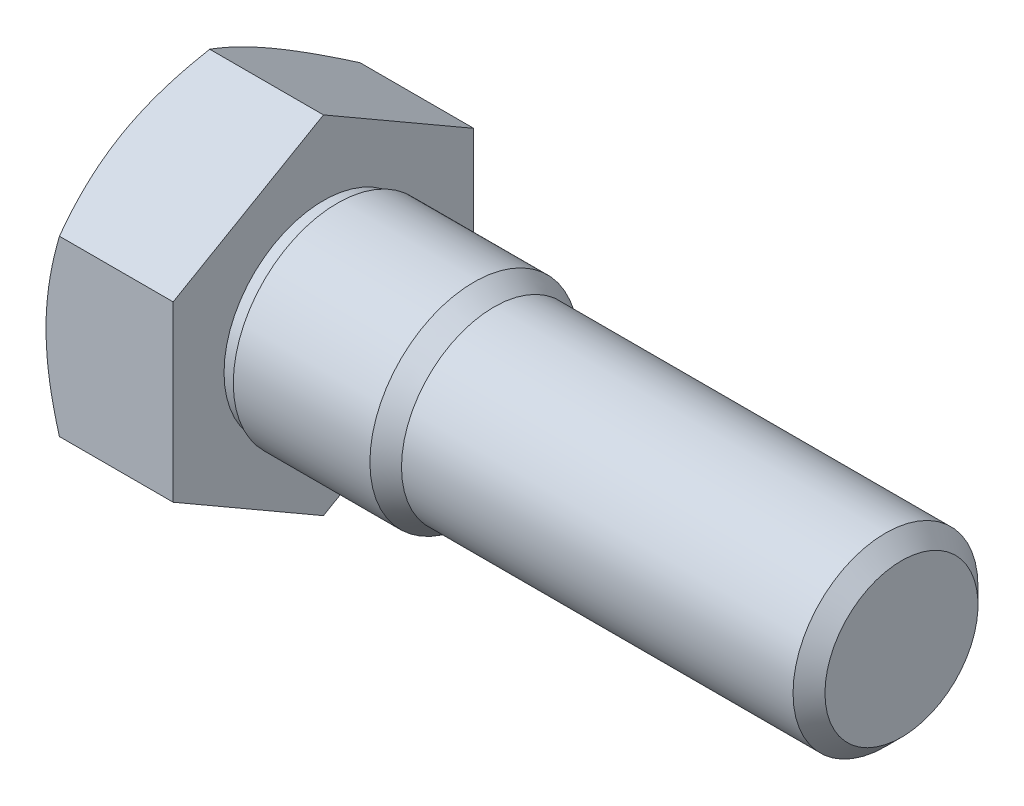
ISO-10303-21;
HEADER;
FILE_DESCRIPTION(('STEP AP214'),'2;1');
FILE_NAME('part.step','',(''),(''),'','','');
FILE_SCHEMA(('AUTOMOTIVE_DESIGN { 1 0 10303 214 1 1 1 1 }'));
ENDSEC;
DATA;
#1=APPLICATION_CONTEXT('core data for automotive mechanical design processes');
#2=APPLICATION_PROTOCOL_DEFINITION('international standard','automotive_design',2000,#1);
#3=PRODUCT_CONTEXT('',#1,'mechanical');
#4=PRODUCT('Part','Part','',(#3));
#5=PRODUCT_RELATED_PRODUCT_CATEGORY('part','',(#4));
#6=PRODUCT_DEFINITION_FORMATION('','',#4);
#7=PRODUCT_DEFINITION_CONTEXT('part definition',#1,'design');
#8=PRODUCT_DEFINITION('design','',#6,#7);
#9=PRODUCT_DEFINITION_SHAPE('','',#8);
#10=(LENGTH_UNIT() NAMED_UNIT(*) SI_UNIT(.MILLI.,.METRE.));
#11=(NAMED_UNIT(*) PLANE_ANGLE_UNIT() SI_UNIT($,.RADIAN.));
#12=(NAMED_UNIT(*) SI_UNIT($,.STERADIAN.) SOLID_ANGLE_UNIT());
#13=UNCERTAINTY_MEASURE_WITH_UNIT(LENGTH_MEASURE(1.E-05),#10,'distance_accuracy_value','');
#14=(GEOMETRIC_REPRESENTATION_CONTEXT(3) GLOBAL_UNCERTAINTY_ASSIGNED_CONTEXT((#13)) GLOBAL_UNIT_ASSIGNED_CONTEXT((#10,
#11,#12)) REPRESENTATION_CONTEXT('',''));
#15=CARTESIAN_POINT('',(0.,0.,0.));
#16=DIRECTION('',(0.,0.,1.));
#17=DIRECTION('',(1.,0.,0.));
#18=AXIS2_PLACEMENT_3D('',#15,#16,#17);
#19=CARTESIAN_POINT('',(5.5,7.50555349946514,0.));
#20=DIRECTION('',(1.,0.,0.));
#21=DIRECTION('',(0.,0.,-1.));
#22=AXIS2_PLACEMENT_3D('',#19,#20,#21);
#23=PLANE('',#22);
#24=DIRECTION('',(0.,0.5,0.866025403784439));
#25=VECTOR('',#24,1.);
#26=CARTESIAN_POINT('',(5.5,3.75277674973257,-6.5));
#27=LINE('',#26,#25);
#28=CARTESIAN_POINT('',(5.5,3.75277674973257,-6.5));
#29=VERTEX_POINT('',#28);
#30=CARTESIAN_POINT('',(5.5,7.50555349946514,0.));
#31=VERTEX_POINT('',#30);
#32=EDGE_CURVE('E157',#29,#31,#27,.T.);
#33=ORIENTED_EDGE('',*,*,#32,.T.);
#34=DIRECTION('',(0.,-0.5,0.866025403784439));
#35=VECTOR('',#34,1.);
#36=CARTESIAN_POINT('',(5.5,7.50555349946514,0.));
#37=LINE('',#36,#35);
#38=CARTESIAN_POINT('',(5.5,3.75277674973257,6.5));
#39=VERTEX_POINT('',#38);
#40=EDGE_CURVE('E155',#31,#39,#37,.T.);
#41=ORIENTED_EDGE('',*,*,#40,.T.);
#42=DIRECTION('',(0.,-1.,0.));
#43=VECTOR('',#42,1.);
#44=CARTESIAN_POINT('',(5.5,3.75277674973257,6.5));
#45=LINE('',#44,#43);
#46=CARTESIAN_POINT('',(5.5,-3.75277674973257,6.5));
#47=VERTEX_POINT('',#46);
#48=EDGE_CURVE('E132',#39,#47,#45,.T.);
#49=ORIENTED_EDGE('',*,*,#48,.T.);
#50=DIRECTION('',(0.,-0.5,-0.866025403784439));
#51=VECTOR('',#50,1.);
#52=CARTESIAN_POINT('',(5.5,-3.75277674973257,6.5));
#53=LINE('',#52,#51);
#54=CARTESIAN_POINT('',(5.5,-7.50555349946513,0.));
#55=VERTEX_POINT('',#54);
#56=EDGE_CURVE('E152',#47,#55,#53,.T.);
#57=ORIENTED_EDGE('',*,*,#56,.T.);
#58=DIRECTION('',(0.,0.5,-0.866025403784439));
#59=VECTOR('',#58,1.);
#60=CARTESIAN_POINT('',(5.5,-7.50555349946513,0.));
#61=LINE('',#60,#59);
#62=CARTESIAN_POINT('',(5.5,-3.75277674973257,-6.5));
#63=VERTEX_POINT('',#62);
#64=EDGE_CURVE('E150',#55,#63,#61,.T.);
#65=ORIENTED_EDGE('',*,*,#64,.T.);
#66=DIRECTION('',(0.,1.,0.));
#67=VECTOR('',#66,1.);
#68=CARTESIAN_POINT('',(5.5,-3.75277674973257,-6.5));
#69=LINE('',#68,#67);
#70=EDGE_CURVE('E148',#63,#29,#69,.T.);
#71=ORIENTED_EDGE('',*,*,#70,.T.);
#72=EDGE_LOOP('',(#33,#41,#49,#57,#65,#71));
#73=FACE_BOUND('',#72,.T.);
#74=CARTESIAN_POINT('',(5.5,0.,0.));
#75=DIRECTION('',(-1.,0.,0.));
#76=DIRECTION('',(0.,0.,1.));
#77=AXIS2_PLACEMENT_3D('',#74,#75,#76);
#78=CIRCLE('',#77,4.3);
#79=CARTESIAN_POINT('',(5.5,0.,4.3));
#80=VERTEX_POINT('',#79);
#81=EDGE_CURVE('E250',#80,#80,#78,.T.);
#82=ORIENTED_EDGE('',*,*,#81,.T.);
#83=EDGE_LOOP('',(#82));
#84=FACE_BOUND('',#83,.T.);
#85=ADVANCED_FACE('F39',(#73,#84),#23,.T.);
#86=CARTESIAN_POINT('',(5.5,3.75277674973257,-6.5));
#87=DIRECTION('',(0.,-0.866025403784439,0.5));
#88=DIRECTION('',(0.,-0.5,-0.866025403784439));
#89=AXIS2_PLACEMENT_3D('',#86,#87,#88);
#90=PLANE('',#89);
#91=CARTESIAN_POINT('',(0.580623251805862,7.50566896951898,0.000199999999999986));
#92=CARTESIAN_POINT('',(0.533004423075481,7.4231786300702,-0.14267745905888));
#93=CARTESIAN_POINT('',(0.487546700602702,7.34038072665458,-0.286087634534913));
#94=CARTESIAN_POINT('',(0.401548682023043,7.17411251123976,-0.574072631317195));
#95=CARTESIAN_POINT('',(0.361010507228023,7.09064192560665,-0.718647926571264));
#96=CARTESIAN_POINT('',(0.247571001123207,6.83889369625719,-1.15468865052003));
#97=CARTESIAN_POINT('',(0.183047807128739,6.66962231516081,-1.44787528284632));
#98=CARTESIAN_POINT('',(0.107386583547492,6.41631077211556,-1.88662374554437));
#99=CARTESIAN_POINT('',(0.0858328564569877,6.33302748139455,-2.03087463649469));
#100=CARTESIAN_POINT('',(0.0496903146061197,6.16608458377294,-2.32002821713809));
#101=CARTESIAN_POINT('',(0.0351008844596676,6.08242501078143,-2.46493084809889));
#102=CARTESIAN_POINT('',(0.0132587525073481,5.91496056339807,-2.75498777942832));
#103=CARTESIAN_POINT('',(0.00599772432210918,5.83115596252171,-2.90014160605421));
#104=CARTESIAN_POINT('',(-0.00103969741776723,5.66347396979287,-3.19057533697495));
#105=CARTESIAN_POINT('',(-0.000816322187793967,5.57959658026911,-3.33585523723636));
#106=CARTESIAN_POINT('',(0.0100834585151664,5.34979921898454,-3.73387594242649));
#107=CARTESIAN_POINT('',(0.0283818178694141,5.20395446807007,-3.98648646102757));
#108=CARTESIAN_POINT('',(0.0864063414576747,4.91323365606636,-4.49002967823568));
#109=CARTESIAN_POINT('',(0.126152338538244,4.76835861741226,-4.74096060593308));
#110=CARTESIAN_POINT('',(0.225505903202147,4.47705272008732,-5.24551722064432));
#111=CARTESIAN_POINT('',(0.285534425638024,4.33065861912703,-5.49907924143591));
#112=CARTESIAN_POINT('',(0.421774992509864,4.04005357906494,-6.00242193575904));
#113=CARTESIAN_POINT('',(0.497955034163588,3.89583891821182,-6.25220905555296));
#114=CARTESIAN_POINT('',(0.58062325180586,3.75266127967874,-6.5002));
#115=B_SPLINE_CURVE_WITH_KNOTS('',3,(#91,#92,#93,#94,#95,#96,#97,#98,#99,#100,#101,#102,#103,
#104,#105,#106,#107,#108,#109,#110,#111,#112,#113,#114),.UNSPECIFIED.,.F.,.F.,(4,2,2,2,2,2,2,2,
2,2,2,4),(0.,0.515105052395587,1.03043143507524,2.06322554824262,2.56697389547996,
3.07067772176453,3.57380860368927,4.07692394242519,4.9527935470566,5.82947446853466,
6.72559912449736,7.61996451221045),.UNSPECIFIED.);
#116=CARTESIAN_POINT('',(0.580556583600758,7.50555349946514,0.));
#117=VERTEX_POINT('',#116);
#118=CARTESIAN_POINT('',(0.,5.62916512459885,-3.25));
#119=VERTEX_POINT('',#118);
#120=EDGE_CURVE('E56',#117,#119,#115,.T.);
#121=ORIENTED_EDGE('',*,*,#120,.F.);
#122=DIRECTION('',(-1.,0.,0.));
#123=VECTOR('',#122,1.);
#124=CARTESIAN_POINT('',(5.5,7.50555349946514,0.));
#125=LINE('',#124,#123);
#126=EDGE_CURVE('E133',#31,#117,#125,.T.);
#127=ORIENTED_EDGE('',*,*,#126,.F.);
#128=ORIENTED_EDGE('',*,*,#32,.F.);
#129=DIRECTION('',(-1.,0.,0.));
#130=VECTOR('',#129,1.);
#131=CARTESIAN_POINT('',(5.5,3.75277674973257,-6.5));
#132=LINE('',#131,#130);
#133=CARTESIAN_POINT('',(0.580556583600758,3.75277674973258,-6.5));
#134=VERTEX_POINT('',#133);
#135=EDGE_CURVE('E145',#29,#134,#132,.T.);
#136=ORIENTED_EDGE('',*,*,#135,.T.);
#137=EDGE_CURVE('E204',#119,#134,#115,.T.);
#138=ORIENTED_EDGE('',*,*,#137,.F.);
#139=EDGE_LOOP('',(#121,#127,#128,#136,#138));
#140=FACE_BOUND('',#139,.T.);
#141=ADVANCED_FACE('F41',(#140),#90,.F.);
#142=CARTESIAN_POINT('',(5.5,7.50555349946514,0.));
#143=DIRECTION('',(0.,-0.866025403784439,-0.5));
#144=DIRECTION('',(0.,0.5,-0.866025403784439));
#145=AXIS2_PLACEMENT_3D('',#142,#143,#144);
#146=PLANE('',#145);
#147=CARTESIAN_POINT('',(0.580623251805863,3.75266127967873,6.5002));
#148=CARTESIAN_POINT('',(0.533004423075481,3.83515161912751,6.35732254094112));
#149=CARTESIAN_POINT('',(0.487546700602703,3.91794952254313,6.21391236546509));
#150=CARTESIAN_POINT('',(0.401548682023043,4.08421773795795,5.92592736868281));
#151=CARTESIAN_POINT('',(0.361010507228023,4.16768832359106,5.78135207342874));
#152=CARTESIAN_POINT('',(0.247571001123208,4.41943655294052,5.34531134947997));
#153=CARTESIAN_POINT('',(0.18304780712874,4.5887079340369,5.05212471715368));
#154=CARTESIAN_POINT('',(0.107386583547493,4.84201947708215,4.61337625445563));
#155=CARTESIAN_POINT('',(0.0858328564569886,4.92530276780316,4.46912536350531));
#156=CARTESIAN_POINT('',(0.0496903146061204,5.09224566542477,4.17997178286191));
#157=CARTESIAN_POINT('',(0.0351008844596682,5.17590523841628,4.03506915190111));
#158=CARTESIAN_POINT('',(0.0132587525073486,5.34336968579964,3.74501222057168));
#159=CARTESIAN_POINT('',(0.0059977243221096,5.427174286676,3.59985839394579));
#160=CARTESIAN_POINT('',(-0.00103969741776688,5.59485627940484,3.30942466302506));
#161=CARTESIAN_POINT('',(-0.000816322187793697,5.6787336689286,3.16414476276365));
#162=CARTESIAN_POINT('',(0.0100834585151666,5.90853103021317,2.76612405757351));
#163=CARTESIAN_POINT('',(0.0283818178694145,6.05437578112764,2.51351353897243));
#164=CARTESIAN_POINT('',(0.0864063414576753,6.34509659313135,2.00997032176432));
#165=CARTESIAN_POINT('',(0.126152338538244,6.48997163178545,1.75903939406692));
#166=CARTESIAN_POINT('',(0.225505903202148,6.78127752911039,1.25448277935568));
#167=CARTESIAN_POINT('',(0.285534425638024,6.92767163007068,1.00092075856409));
#168=CARTESIAN_POINT('',(0.421774992509865,7.21827667013277,0.497578064240956));
#169=CARTESIAN_POINT('',(0.497955034163589,7.36249133098589,0.247790944447036));
#170=CARTESIAN_POINT('',(0.580623251805862,7.50566896951898,-0.000199999999999871));
#171=B_SPLINE_CURVE_WITH_KNOTS('',3,(#147,#148,#149,#150,#151,#152,#153,#154,#155,#156,#157,
#158,#159,#160,#161,#162,#163,#164,#165,#166,#167,#168,#169,#170),.UNSPECIFIED.,.F.,.F.,(4,2,2,
2,2,2,2,2,2,2,2,4),(0.,0.515105052395587,1.03043143507524,2.06322554824262,2.56697389547996,
3.07067772176453,3.57380860368927,4.0769239424252,4.9527935470566,5.82947446853466,
6.72559912449736,7.61996451221046),.UNSPECIFIED.);
#172=CARTESIAN_POINT('',(0.580556583600758,3.75277674973257,6.5));
#173=VERTEX_POINT('',#172);
#174=CARTESIAN_POINT('',(0.,5.62916512459885,3.25));
#175=VERTEX_POINT('',#174);
#176=EDGE_CURVE('E63',#173,#175,#171,.T.);
#177=ORIENTED_EDGE('',*,*,#176,.F.);
#178=DIRECTION('',(-1.,0.,0.));
#179=VECTOR('',#178,1.);
#180=CARTESIAN_POINT('',(5.5,3.75277674973257,6.5));
#181=LINE('',#180,#179);
#182=EDGE_CURVE('E125',#39,#173,#181,.T.);
#183=ORIENTED_EDGE('',*,*,#182,.F.);
#184=ORIENTED_EDGE('',*,*,#40,.F.);
#185=ORIENTED_EDGE('',*,*,#126,.T.);
#186=EDGE_CURVE('E128',#175,#117,#171,.T.);
#187=ORIENTED_EDGE('',*,*,#186,.F.);
#188=EDGE_LOOP('',(#177,#183,#184,#185,#187));
#189=FACE_BOUND('',#188,.T.);
#190=ADVANCED_FACE('F124',(#189),#146,.F.);
#191=CARTESIAN_POINT('',(5.5,3.75277674973257,6.5));
#192=DIRECTION('',(0.,0.,-1.));
#193=DIRECTION('',(0.,1.,0.));
#194=AXIS2_PLACEMENT_3D('',#191,#192,#193);
#195=PLANE('',#194);
#196=CARTESIAN_POINT('',(3.11042358451593,-9.95291698368312,6.5));
#197=CARTESIAN_POINT('',(2.97250893962359,-9.66753022820204,6.5));
#198=CARTESIAN_POINT('',(2.83596528100064,-9.38146872221017,6.5));
#199=CARTESIAN_POINT('',(2.5664033637316,-8.80763137697963,6.5));
#200=CARTESIAN_POINT('',(2.4333857154693,-8.51985525134958,6.5));
#201=CARTESIAN_POINT('',(2.1709585020953,-7.94066929123455,6.5));
#202=CARTESIAN_POINT('',(2.04157394066242,-7.64924808662453,6.5));
#203=CARTESIAN_POINT('',(1.7883622026228,-7.06401043497072,6.5));
#204=CARTESIAN_POINT('',(1.6645347363351,-6.77019411372553,6.5));
#205=CARTESIAN_POINT('',(1.42244480194618,-6.17605150217576,6.5));
#206=CARTESIAN_POINT('',(1.30426931829825,-5.87568957429352,6.5));
#207=CARTESIAN_POINT('',(1.07717389386351,-5.27142269448721,6.5));
#208=CARTESIAN_POINT('',(0.968254982821968,-4.96751735264218,6.5));
#209=CARTESIAN_POINT('',(0.762599022073925,-4.3563054172546,6.5));
#210=CARTESIAN_POINT('',(0.66583607379263,-4.04900762614672,6.5));
#211=CARTESIAN_POINT('',(0.487635712034277,-3.43004022230995,6.5));
#212=CARTESIAN_POINT('',(0.406193452076773,-3.11837202573308,6.5));
#213=CARTESIAN_POINT('',(0.262584080192574,-2.49046594828964,6.5));
#214=CARTESIAN_POINT('',(0.200422100523433,-2.17422687409774,6.5));
#215=CARTESIAN_POINT('',(0.0995742225329251,-1.5378916759482,6.5));
#216=CARTESIAN_POINT('',(0.0608883449673841,-1.21779554858069,6.5));
#217=CARTESIAN_POINT('',(0.0229465620569963,-0.737141963129273,6.5));
#218=CARTESIAN_POINT('',(0.0136452147630805,-0.577336886979715,6.5));
#219=CARTESIAN_POINT('',(0.00181408796460926,-0.257468906786591,6.5));
#220=CARTESIAN_POINT('',(-0.000715779477275075,-0.0974060061182544,6.5));
#221=CARTESIAN_POINT('',(0.00106401163083768,0.222635442153788,6.5));
#222=CARTESIAN_POINT('',(0.00537175068700645,0.382614000823775,6.5));
#223=CARTESIAN_POINT('',(0.0207175825196428,0.702250634961165,6.5));
#224=CARTESIAN_POINT('',(0.0317560114013211,0.861908694024547,6.5));
#225=CARTESIAN_POINT('',(0.06643686833393,1.24887053403167,6.5));
#226=CARTESIAN_POINT('',(0.0934518785931848,1.47587694728924,6.5));
#227=CARTESIAN_POINT('',(0.159589888005033,1.928150306129,6.5));
#228=CARTESIAN_POINT('',(0.198716192016406,2.15341675970358,6.5));
#229=CARTESIAN_POINT('',(0.287689170365803,2.60202427843394,6.5));
#230=CARTESIAN_POINT('',(0.337545980881492,2.8253633140108,6.5));
#231=CARTESIAN_POINT('',(0.446458764113087,3.2697435482239,6.5));
#232=CARTESIAN_POINT('',(0.505513870223697,3.490784961237,6.5));
#233=CARTESIAN_POINT('',(0.632954116493096,3.93601414582643,6.5));
#234=CARTESIAN_POINT('',(0.701532472923349,4.16014622959198,6.5));
#235=CARTESIAN_POINT('',(0.845465123541113,4.60604131565927,6.5));
#236=CARTESIAN_POINT('',(0.920814744092769,4.82780583559536,6.5));
#237=CARTESIAN_POINT('',(1.07673350293346,5.26807593346465,6.5));
#238=CARTESIAN_POINT('',(1.15727087504748,5.48659282898121,6.5));
#239=CARTESIAN_POINT('',(1.32307270438629,5.92193123194631,6.5));
#240=CARTESIAN_POINT('',(1.40833907213761,6.13875201319738,6.5));
#241=CARTESIAN_POINT('',(1.49550213563039,6.35478510853361,6.5));
#242=B_SPLINE_CURVE_WITH_KNOTS('',3,(#196,#197,#198,#199,#200,#201,#202,#203,#204,#205,#206,
#207,#208,#209,#210,#211,#212,#213,#214,#215,#216,#217,#218,#219,#220,#221,#222,#223,#224,#225,
#226,#227,#228,#229,#230,#231,#232,#233,#234,#235,#236,#237,#238,#239,#240,#241),.UNSPECIFIED.,
.F.,.F.,(4,2,2,2,2,2,2,2,2,2,2,2,2,2,2,2,2,2,2,2,2,2,4),(0.,0.95090416286494,1.90197187472378,
2.85848216299727,3.81494253212837,4.78314526620907,5.7514555671736,6.71766655133575,
7.68357137261127,8.64973308985232,9.61589566130053,10.0960003863607,10.5760988765457,
11.0560626144432,11.5360503218788,12.2214931749033,12.9071232326805,13.5934038106301,
14.2796197706253,14.9826563668411,15.6852113891479,16.3838119598017,17.0826968524681),.UNSPECIFIED.);
#243=CARTESIAN_POINT('',(0.580556583600758,-3.75277674973257,6.5));
#244=VERTEX_POINT('',#243);
#245=CARTESIAN_POINT('',(0.,0.,6.5));
#246=VERTEX_POINT('',#245);
#247=EDGE_CURVE('E118',#244,#246,#242,.T.);
#248=ORIENTED_EDGE('',*,*,#247,.F.);
#249=DIRECTION('',(-1.,0.,0.));
#250=VECTOR('',#249,1.);
#251=CARTESIAN_POINT('',(5.5,-3.75277674973257,6.5));
#252=LINE('',#251,#250);
#253=EDGE_CURVE('E134',#47,#244,#252,.T.);
#254=ORIENTED_EDGE('',*,*,#253,.F.);
#255=ORIENTED_EDGE('',*,*,#48,.F.);
#256=ORIENTED_EDGE('',*,*,#182,.T.);
#257=EDGE_CURVE('E110',#246,#173,#242,.T.);
#258=ORIENTED_EDGE('',*,*,#257,.F.);
#259=EDGE_LOOP('',(#248,#254,#255,#256,#258));
#260=FACE_BOUND('',#259,.T.);
#261=ADVANCED_FACE('F130',(#260),#195,.F.);
#262=CARTESIAN_POINT('',(5.5,-3.75277674973257,6.5));
#263=DIRECTION('',(0.,0.866025403784438,-0.5));
#264=DIRECTION('',(0.,0.5,0.866025403784439));
#265=AXIS2_PLACEMENT_3D('',#262,#263,#264);
#266=PLANE('',#265);
#267=CARTESIAN_POINT('',(0.580623251805862,-7.50566896951897,-0.000199999999997326));
#268=CARTESIAN_POINT('',(0.533004423075481,-7.4231786300702,0.142677459058883));
#269=CARTESIAN_POINT('',(0.487546700602703,-7.34038072665458,0.286087634534915));
#270=CARTESIAN_POINT('',(0.401548682023043,-7.17411251123976,0.574072631317196));
#271=CARTESIAN_POINT('',(0.361010507228023,-7.09064192560665,0.718647926571265));
#272=CARTESIAN_POINT('',(0.247571001123207,-6.83889369625719,1.15468865052003));
#273=CARTESIAN_POINT('',(0.18304780712874,-6.66962231516081,1.44787528284632));
#274=CARTESIAN_POINT('',(0.107386583547492,-6.41631077211555,1.88662374554437));
#275=CARTESIAN_POINT('',(0.0858328564569881,-6.33302748139454,2.03087463649469));
#276=CARTESIAN_POINT('',(0.0496903146061199,-6.16608458377293,2.32002821713809));
#277=CARTESIAN_POINT('',(0.0351008844596678,-6.08242501078143,2.46493084809889));
#278=CARTESIAN_POINT('',(0.0132587525073484,-5.91496056339807,2.75498777942832));
#279=CARTESIAN_POINT('',(0.00599772432210937,-5.8311559625217,2.90014160605421));
#280=CARTESIAN_POINT('',(-0.00103969741776715,-5.66347396979287,3.19057533697495));
#281=CARTESIAN_POINT('',(-0.00081632218779399,-5.5795965802691,3.33585523723636));
#282=CARTESIAN_POINT('',(0.0100834585151661,-5.34979921898453,3.73387594242649));
#283=CARTESIAN_POINT('',(0.0283818178694136,-5.20395446807007,3.98648646102757));
#284=CARTESIAN_POINT('',(0.0864063414576745,-4.91323365606636,4.49002967823568));
#285=CARTESIAN_POINT('',(0.126152338538244,-4.76835861741226,4.74096060593308));
#286=CARTESIAN_POINT('',(0.225505903202147,-4.47705272008732,5.24551722064432));
#287=CARTESIAN_POINT('',(0.285534425638024,-4.33065861912703,5.49907924143591));
#288=CARTESIAN_POINT('',(0.421774992509864,-4.04005357906493,6.00242193575905));
#289=CARTESIAN_POINT('',(0.497955034163588,-3.89583891821181,6.25220905555296));
#290=CARTESIAN_POINT('',(0.580623251805862,-3.75266127967873,6.5002));
#291=B_SPLINE_CURVE_WITH_KNOTS('',3,(#267,#268,#269,#270,#271,#272,#273,#274,#275,#276,#277,
#278,#279,#280,#281,#282,#283,#284,#285,#286,#287,#288,#289,#290),.UNSPECIFIED.,.F.,.F.,(4,2,2,
2,2,2,2,2,2,2,2,4),(0.,0.515105052395587,1.03043143507524,2.06322554824262,2.56697389547996,
3.07067772176453,3.57380860368927,4.07692394242519,4.9527935470566,5.82947446853466,
6.72559912449736,7.61996451221045),.UNSPECIFIED.);
#292=CARTESIAN_POINT('',(0.580556583600758,-7.50555349946514,0.));
#293=VERTEX_POINT('',#292);
#294=CARTESIAN_POINT('',(0.,-5.62916512459885,3.25));
#295=VERTEX_POINT('',#294);
#296=EDGE_CURVE('E209',#293,#295,#291,.T.);
#297=ORIENTED_EDGE('',*,*,#296,.F.);
#298=DIRECTION('',(-1.,0.,0.));
#299=VECTOR('',#298,1.);
#300=CARTESIAN_POINT('',(5.5,-7.50555349946513,0.));
#301=LINE('',#300,#299);
#302=EDGE_CURVE('E137',#55,#293,#301,.T.);
#303=ORIENTED_EDGE('',*,*,#302,.F.);
#304=ORIENTED_EDGE('',*,*,#56,.F.);
#305=ORIENTED_EDGE('',*,*,#253,.T.);
#306=EDGE_CURVE('E119',#295,#244,#291,.T.);
#307=ORIENTED_EDGE('',*,*,#306,.F.);
#308=EDGE_LOOP('',(#297,#303,#304,#305,#307));
#309=FACE_BOUND('',#308,.T.);
#310=ADVANCED_FACE('F215',(#309),#266,.F.);
#311=CARTESIAN_POINT('',(5.5,-7.50555349946513,0.));
#312=DIRECTION('',(0.,0.866025403784439,0.5));
#313=DIRECTION('',(0.,-0.5,0.866025403784439));
#314=AXIS2_PLACEMENT_3D('',#311,#312,#313);
#315=PLANE('',#314);
#316=CARTESIAN_POINT('',(0.580623251805861,-3.75266127967873,-6.5002));
#317=CARTESIAN_POINT('',(0.53300442307548,-3.83515161912751,-6.35732254094112));
#318=CARTESIAN_POINT('',(0.487546700602702,-3.91794952254312,-6.21391236546509));
#319=CARTESIAN_POINT('',(0.401548682023042,-4.08421773795795,-5.9259273686828));
#320=CARTESIAN_POINT('',(0.361010507228022,-4.16768832359105,-5.78135207342874));
#321=CARTESIAN_POINT('',(0.247571001123206,-4.41943655294051,-5.34531134947997));
#322=CARTESIAN_POINT('',(0.183047807128738,-4.58870793403689,-5.05212471715368));
#323=CARTESIAN_POINT('',(0.107386583547491,-4.84201947708215,-4.61337625445563));
#324=CARTESIAN_POINT('',(0.0858328564569877,-4.92530276780316,-4.46912536350531));
#325=CARTESIAN_POINT('',(0.0496903146061197,-5.09224566542477,-4.17997178286191));
#326=CARTESIAN_POINT('',(0.0351008844596675,-5.17590523841627,-4.03506915190111));
#327=CARTESIAN_POINT('',(0.013258752507348,-5.34336968579964,-3.74501222057168));
#328=CARTESIAN_POINT('',(0.00599772432210916,-5.427174286676,-3.59985839394579));
#329=CARTESIAN_POINT('',(-0.00103969741776745,-5.59485627940483,-3.30942466302505));
#330=CARTESIAN_POINT('',(-0.000816322187794543,-5.6787336689286,-3.16414476276364));
#331=CARTESIAN_POINT('',(0.0100834585151653,-5.90853103021317,-2.76612405757351));
#332=CARTESIAN_POINT('',(0.0283818178694132,-6.05437578112763,-2.51351353897243));
#333=CARTESIAN_POINT('',(0.0864063414576746,-6.34509659313134,-2.00997032176432));
#334=CARTESIAN_POINT('',(0.126152338538244,-6.48997163178544,-1.75903939406692));
#335=CARTESIAN_POINT('',(0.225505903202148,-6.78127752911038,-1.25448277935568));
#336=CARTESIAN_POINT('',(0.285534425638024,-6.92767163007067,-1.00092075856408));
#337=CARTESIAN_POINT('',(0.421774992509865,-7.21827667013277,-0.497578064240953));
#338=CARTESIAN_POINT('',(0.497955034163588,-7.36249133098589,-0.247790944447035));
#339=CARTESIAN_POINT('',(0.580623251805862,-7.50566896951897,0.000200000000002371));
#340=B_SPLINE_CURVE_WITH_KNOTS('',3,(#316,#317,#318,#319,#320,#321,#322,#323,#324,#325,#326,
#327,#328,#329,#330,#331,#332,#333,#334,#335,#336,#337,#338,#339),.UNSPECIFIED.,.F.,.F.,(4,2,2,
2,2,2,2,2,2,2,2,4),(0.,0.515105052395587,1.03043143507524,2.06322554824262,2.56697389547996,
3.07067772176453,3.57380860368927,4.07692394242519,4.9527935470566,5.82947446853466,
6.72559912449736,7.61996451221046),.UNSPECIFIED.);
#341=CARTESIAN_POINT('',(0.580556583600758,-3.75277674973257,-6.5));
#342=VERTEX_POINT('',#341);
#343=CARTESIAN_POINT('',(0.,-5.62916512459885,-3.25));
#344=VERTEX_POINT('',#343);
#345=EDGE_CURVE('E196',#342,#344,#340,.T.);
#346=ORIENTED_EDGE('',*,*,#345,.F.);
#347=DIRECTION('',(-1.,0.,0.));
#348=VECTOR('',#347,1.);
#349=CARTESIAN_POINT('',(5.5,-3.75277674973257,-6.5));
#350=LINE('',#349,#348);
#351=EDGE_CURVE('E142',#63,#342,#350,.T.);
#352=ORIENTED_EDGE('',*,*,#351,.F.);
#353=ORIENTED_EDGE('',*,*,#64,.F.);
#354=ORIENTED_EDGE('',*,*,#302,.T.);
#355=EDGE_CURVE('E214',#344,#293,#340,.T.);
#356=ORIENTED_EDGE('',*,*,#355,.F.);
#357=EDGE_LOOP('',(#346,#352,#353,#354,#356));
#358=FACE_BOUND('',#357,.T.);
#359=ADVANCED_FACE('F218',(#358),#315,.F.);
#360=CARTESIAN_POINT('',(5.5,-3.75277674973257,-6.5));
#361=DIRECTION('',(0.,0.,1.));
#362=DIRECTION('',(0.,-1.,0.));
#363=AXIS2_PLACEMENT_3D('',#360,#361,#362);
#364=PLANE('',#363);
#365=CARTESIAN_POINT('',(3.11042470603035,-9.95291930376012,-6.5));
#366=CARTESIAN_POINT('',(2.97251001315145,-9.66753246885863,-6.5));
#367=CARTESIAN_POINT('',(2.83596630657017,-9.38147088338568,-6.5));
#368=CARTESIAN_POINT('',(2.56640429363987,-8.80763337892722,-6.5));
#369=CARTESIAN_POINT('',(2.43338659767469,-8.51985717355028,-6.5));
#370=CARTESIAN_POINT('',(2.17095928887087,-7.94067105260803,-6.5));
#371=CARTESIAN_POINT('',(2.04157467972122,-7.64924976691208,-6.5));
#372=CARTESIAN_POINT('',(1.7883628471261,-7.06401195248325,-6.5));
#373=CARTESIAN_POINT('',(1.6645353339996,-6.77019554954903,-6.5));
#374=CARTESIAN_POINT('',(1.42244530673858,-6.17605277242123,-6.5));
#375=CARTESIAN_POINT('',(1.30426977708242,-5.87569076063596,-6.5));
#376=CARTESIAN_POINT('',(1.07717426318302,-5.27142371161893,-6.5));
#377=CARTESIAN_POINT('',(0.968255308685938,-4.96751828446582,-6.5));
#378=CARTESIAN_POINT('',(0.762599265352812,-4.35630617685149,-6.5));
#379=CARTESIAN_POINT('',(0.665836277927867,-4.04900829883083,-6.5));
#380=CARTESIAN_POINT('',(0.487635844507522,-3.43004071877248,-6.5));
#381=CARTESIAN_POINT('',(0.406193552027363,-3.11837243288824,-6.5));
#382=CARTESIAN_POINT('',(0.262584114338471,-2.49046612743067,-6.5));
#383=CARTESIAN_POINT('',(0.200422104252974,-2.17422691386555,-6.5));
#384=CARTESIAN_POINT('',(0.0995741867177431,-1.53789143377901,-6.5));
#385=CARTESIAN_POINT('',(0.0608883000085712,-1.21779516385023,-6.5));
#386=CARTESIAN_POINT('',(0.0229465221061716,-0.737141364811435,-6.5));
#387=CARTESIAN_POINT('',(0.0136451795582177,-0.577336217866327,-6.5));
#388=CARTESIAN_POINT('',(0.00181406842544221,-0.257468096283204,-6.5));
#389=CARTESIAN_POINT('',(-0.000715788096644291,-0.0974051250204099,-6.5));
#390=CARTESIAN_POINT('',(0.00106403083254992,0.222636463870254,-6.5));
#391=CARTESIAN_POINT('',(0.00537178679122468,0.382615092564563,-6.5));
#392=CARTESIAN_POINT('',(0.0207176579299873,0.702251865778325,-6.5));
#393=CARTESIAN_POINT('',(0.031756109214863,0.861909993893743,-6.5));
#394=CARTESIAN_POINT('',(0.0664370213245343,1.24887194369331,-6.5));
#395=CARTESIAN_POINT('',(0.093452063575619,1.47587839735562,-6.5));
#396=CARTESIAN_POINT('',(0.159590138729236,1.92815183530151,-6.5));
#397=CARTESIAN_POINT('',(0.198716476491743,2.15341832757691,-6.5));
#398=CARTESIAN_POINT('',(0.287689522940581,2.60202592242475,-6.5));
#399=CARTESIAN_POINT('',(0.337546367808207,2.82536499541634,-6.5));
#400=CARTESIAN_POINT('',(0.446459219481052,3.26974530346815,-6.5));
#401=CARTESIAN_POINT('',(0.505514359680918,3.49078675290536,-6.5));
#402=CARTESIAN_POINT('',(0.632954674370405,3.9360160111231,-6.5));
#403=CARTESIAN_POINT('',(0.70153306513198,4.16014813207211,-6.5));
#404=CARTESIAN_POINT('',(0.845465783402123,4.60604329209093,-6.5));
#405=CARTESIAN_POINT('',(0.920815437274397,4.82780784879569,-6.5));
#406=CARTESIAN_POINT('',(1.07673426145659,5.26807801966739,-6.5));
#407=CARTESIAN_POINT('',(1.15727166559238,5.4865949514202,-6.5));
#408=CARTESIAN_POINT('',(1.32307355801034,5.921933426937,-6.5));
#409=CARTESIAN_POINT('',(1.40833995682003,6.13875424450297,-6.5));
#410=CARTESIAN_POINT('',(1.49550305089155,6.35478737621632,-6.5));
#411=B_SPLINE_CURVE_WITH_KNOTS('',3,(#365,#366,#367,#368,#369,#370,#371,#372,#373,#374,#375,
#376,#377,#378,#379,#380,#381,#382,#383,#384,#385,#386,#387,#388,#389,#390,#391,#392,#393,#394,
#395,#396,#397,#398,#399,#400,#401,#402,#403,#404,#405,#406,#407,#408,#409,#410),.UNSPECIFIED.,
.F.,.F.,(4,2,2,2,2,2,2,2,2,2,2,2,2,2,2,2,2,2,2,2,2,2,4),(0.,0.950904440030121,1.90197242910012,
2.85848299779176,3.81494364731855,4.78314666613984,5.75145725194119,6.71766851991497,
7.68357362477189,8.64973576896117,9.61589876672907,10.0960037028175,10.5761024040381,
11.0560663531158,11.5360542716923,12.2214972563459,12.9071274458287,13.5934081558082,
14.2796242478146,14.9826609808827,15.685216139834,16.3838168457429,17.0827018739316),.UNSPECIFIED.);
#412=CARTESIAN_POINT('',(0.,0.,-6.5));
#413=VERTEX_POINT('',#412);
#414=EDGE_CURVE('E272',#134,#413,#411,.F.);
#415=ORIENTED_EDGE('',*,*,#414,.F.);
#416=ORIENTED_EDGE('',*,*,#135,.F.);
#417=ORIENTED_EDGE('',*,*,#70,.F.);
#418=ORIENTED_EDGE('',*,*,#351,.T.);
#419=EDGE_CURVE('E186',#413,#342,#411,.F.);
#420=ORIENTED_EDGE('',*,*,#419,.F.);
#421=EDGE_LOOP('',(#415,#416,#417,#418,#420));
#422=FACE_BOUND('',#421,.T.);
#423=ADVANCED_FACE('F222',(#422),#364,.F.);
#424=CARTESIAN_POINT('',(0.,0.,0.));
#425=DIRECTION('',(1.,0.,0.));
#426=DIRECTION('',(0.,0.,-1.));
#427=AXIS2_PLACEMENT_3D('',#424,#425,#426);
#428=CONICAL_SURFACE('',#427,6.5,1.0471975511966);
#429=ORIENTED_EDGE('',*,*,#345,.T.);
#430=CARTESIAN_POINT('',(0.,0.,0.));
#431=DIRECTION('',(1.,0.,0.));
#432=DIRECTION('',(0.,0.,-1.));
#433=AXIS2_PLACEMENT_3D('',#430,#431,#432);
#434=CIRCLE('',#433,6.5);
#435=EDGE_CURVE('E44',#344,#413,#434,.T.);
#436=ORIENTED_EDGE('',*,*,#435,.T.);
#437=ORIENTED_EDGE('',*,*,#419,.T.);
#438=EDGE_LOOP('',(#429,#436,#437));
#439=FACE_BOUND('',#438,.T.);
#440=ADVANCED_FACE('F179',(#439),#428,.T.);
#441=ORIENTED_EDGE('',*,*,#296,.T.);
#442=EDGE_CURVE('E286',#295,#344,#434,.T.);
#443=ORIENTED_EDGE('',*,*,#442,.T.);
#444=ORIENTED_EDGE('',*,*,#355,.T.);
#445=EDGE_LOOP('',(#441,#443,#444));
#446=FACE_BOUND('',#445,.T.);
#447=ADVANCED_FACE('F177',(#446),#428,.T.);
#448=ORIENTED_EDGE('',*,*,#247,.T.);
#449=EDGE_CURVE('E294',#246,#295,#434,.T.);
#450=ORIENTED_EDGE('',*,*,#449,.T.);
#451=ORIENTED_EDGE('',*,*,#306,.T.);
#452=EDGE_LOOP('',(#448,#450,#451));
#453=FACE_BOUND('',#452,.T.);
#454=ADVANCED_FACE('F172',(#453),#428,.T.);
#455=ORIENTED_EDGE('',*,*,#257,.T.);
#456=ORIENTED_EDGE('',*,*,#176,.T.);
#457=CARTESIAN_POINT('',(0.,0.,0.));
#458=DIRECTION('',(-1.,0.,0.));
#459=DIRECTION('',(0.,0.,1.));
#460=AXIS2_PLACEMENT_3D('',#457,#458,#459);
#461=CIRCLE('',#460,6.5);
#462=EDGE_CURVE('E113',#246,#175,#461,.T.);
#463=ORIENTED_EDGE('',*,*,#462,.F.);
#464=EDGE_LOOP('',(#455,#456,#463));
#465=FACE_BOUND('',#464,.T.);
#466=ADVANCED_FACE('F111',(#465),#428,.T.);
#467=ORIENTED_EDGE('',*,*,#186,.T.);
#468=ORIENTED_EDGE('',*,*,#120,.T.);
#469=EDGE_CURVE('E49',#119,#175,#434,.T.);
#470=ORIENTED_EDGE('',*,*,#469,.T.);
#471=EDGE_LOOP('',(#467,#468,#470));
#472=FACE_BOUND('',#471,.T.);
#473=ADVANCED_FACE('F237',(#472),#428,.T.);
#474=ORIENTED_EDGE('',*,*,#137,.T.);
#475=ORIENTED_EDGE('',*,*,#414,.T.);
#476=EDGE_CURVE('E11',#413,#119,#434,.T.);
#477=ORIENTED_EDGE('',*,*,#476,.T.);
#478=EDGE_LOOP('',(#474,#475,#477));
#479=FACE_BOUND('',#478,.T.);
#480=ADVANCED_FACE('F229',(#479),#428,.T.);
#481=CARTESIAN_POINT('',(0.,7.50555349946514,0.));
#482=DIRECTION('',(1.,0.,0.));
#483=DIRECTION('',(0.,0.,-1.));
#484=AXIS2_PLACEMENT_3D('',#481,#482,#483);
#485=PLANE('',#484);
#486=ORIENTED_EDGE('',*,*,#476,.F.);
#487=ORIENTED_EDGE('',*,*,#435,.F.);
#488=ORIENTED_EDGE('',*,*,#442,.F.);
#489=ORIENTED_EDGE('',*,*,#449,.F.);
#490=ORIENTED_EDGE('',*,*,#462,.T.);
#491=ORIENTED_EDGE('',*,*,#469,.F.);
#492=EDGE_LOOP('',(#486,#487,#488,#489,#490,#491));
#493=FACE_BOUND('',#492,.T.);
#494=ADVANCED_FACE('F227',(#493),#485,.F.);
#495=CARTESIAN_POINT('',(30.5,3.3095,0.));
#496=DIRECTION('',(-1.,0.,0.));
#497=DIRECTION('',(0.,0.,1.));
#498=AXIS2_PLACEMENT_3D('',#495,#496,#497);
#499=PLANE('',#498);
#500=CARTESIAN_POINT('',(30.5,0.,0.));
#501=DIRECTION('',(-1.,0.,0.));
#502=DIRECTION('',(0.,0.,1.));
#503=AXIS2_PLACEMENT_3D('',#500,#501,#502);
#504=CIRCLE('',#503,3.3095);
#505=CARTESIAN_POINT('',(30.5,0.,3.3095));
#506=VERTEX_POINT('',#505);
#507=EDGE_CURVE('E269',#506,#506,#504,.T.);
#508=ORIENTED_EDGE('',*,*,#507,.F.);
#509=EDGE_LOOP('',(#508));
#510=FACE_BOUND('',#509,.T.);
#511=ADVANCED_FACE('F180',(#510),#499,.F.);
#512=CARTESIAN_POINT('',(30.5,0.,0.));
#513=DIRECTION('',(-1.,0.,0.));
#514=DIRECTION('',(0.,0.,1.));
#515=AXIS2_PLACEMENT_3D('',#512,#513,#514);
#516=CONICAL_SURFACE('',#515,3.3095,0.785398163397451);
#517=CARTESIAN_POINT('',(29.8095,0.,0.));
#518=DIRECTION('',(-1.,0.,0.));
#519=DIRECTION('',(0.,0.,1.));
#520=AXIS2_PLACEMENT_3D('',#517,#518,#519);
#521=CIRCLE('',#520,4.);
#522=CARTESIAN_POINT('',(29.8095,0.,4.));
#523=VERTEX_POINT('',#522);
#524=EDGE_CURVE('E266',#523,#523,#521,.T.);
#525=ORIENTED_EDGE('',*,*,#524,.F.);
#526=EDGE_LOOP('',(#525));
#527=FACE_BOUND('',#526,.T.);
#528=ORIENTED_EDGE('',*,*,#507,.T.);
#529=EDGE_LOOP('',(#528));
#530=FACE_BOUND('',#529,.T.);
#531=ADVANCED_FACE('F235',(#527,#530),#516,.T.);
#532=CARTESIAN_POINT('',(0.,0.,0.));
#533=DIRECTION('',(-1.,0.,0.));
#534=DIRECTION('',(0.,0.,1.));
#535=AXIS2_PLACEMENT_3D('',#532,#533,#534);
#536=CYLINDRICAL_SURFACE('',#535,4.);
#537=CARTESIAN_POINT('',(12.875,0.,0.));
#538=DIRECTION('',(-1.,0.,0.));
#539=DIRECTION('',(0.,0.,1.));
#540=AXIS2_PLACEMENT_3D('',#537,#538,#539);
#541=CIRCLE('',#540,4.);
#542=CARTESIAN_POINT('',(12.875,0.,4.));
#543=VERTEX_POINT('',#542);
#544=EDGE_CURVE('E263',#543,#543,#541,.T.);
#545=ORIENTED_EDGE('',*,*,#544,.F.);
#546=EDGE_LOOP('',(#545));
#547=FACE_BOUND('',#546,.T.);
#548=ORIENTED_EDGE('',*,*,#524,.T.);
#549=EDGE_LOOP('',(#548));
#550=FACE_BOUND('',#549,.T.);
#551=ADVANCED_FACE('F409',(#547,#550),#536,.T.);
#552=CARTESIAN_POINT('',(12.875,0.,0.));
#553=DIRECTION('',(-1.,0.,0.));
#554=DIRECTION('',(0.,0.,1.));
#555=AXIS2_PLACEMENT_3D('',#552,#553,#554);
#556=CONICAL_SURFACE('',#555,4.,0.523598775598301);
#557=CARTESIAN_POINT('',(12.0089745962156,0.,0.));
#558=DIRECTION('',(-1.,0.,0.));
#559=DIRECTION('',(0.,0.,1.));
#560=AXIS2_PLACEMENT_3D('',#557,#558,#559);
#561=CIRCLE('',#560,4.5);
#562=CARTESIAN_POINT('',(12.0089745962156,0.,4.5));
#563=VERTEX_POINT('',#562);
#564=EDGE_CURVE('E260',#563,#563,#561,.T.);
#565=ORIENTED_EDGE('',*,*,#564,.F.);
#566=EDGE_LOOP('',(#565));
#567=FACE_BOUND('',#566,.T.);
#568=ORIENTED_EDGE('',*,*,#544,.T.);
#569=EDGE_LOOP('',(#568));
#570=FACE_BOUND('',#569,.T.);
#571=ADVANCED_FACE('F418',(#567,#570),#556,.T.);
#572=CARTESIAN_POINT('',(0.,0.,0.));
#573=DIRECTION('',(-1.,0.,0.));
#574=DIRECTION('',(0.,0.,1.));
#575=AXIS2_PLACEMENT_3D('',#572,#573,#574);
#576=CYLINDRICAL_SURFACE('',#575,4.5);
#577=CARTESIAN_POINT('',(6.1,0.,0.));
#578=DIRECTION('',(-1.,0.,0.));
#579=DIRECTION('',(0.,0.,1.));
#580=AXIS2_PLACEMENT_3D('',#577,#578,#579);
#581=CIRCLE('',#580,4.5);
#582=CARTESIAN_POINT('',(6.1,0.,4.5));
#583=VERTEX_POINT('',#582);
#584=EDGE_CURVE('E255',#583,#583,#581,.T.);
#585=ORIENTED_EDGE('',*,*,#584,.F.);
#586=EDGE_LOOP('',(#585));
#587=FACE_BOUND('',#586,.T.);
#588=ORIENTED_EDGE('',*,*,#564,.T.);
#589=EDGE_LOOP('',(#588));
#590=FACE_BOUND('',#589,.T.);
#591=ADVANCED_FACE('F428',(#587,#590),#576,.T.);
#592=CARTESIAN_POINT('',(6.1,4.3,0.));
#593=DIRECTION('',(1.,0.,0.));
#594=DIRECTION('',(0.,0.,-1.));
#595=AXIS2_PLACEMENT_3D('',#592,#593,#594);
#596=PLANE('',#595);
#597=CARTESIAN_POINT('',(6.1,0.,0.));
#598=DIRECTION('',(-1.,0.,0.));
#599=DIRECTION('',(0.,0.,1.));
#600=AXIS2_PLACEMENT_3D('',#597,#598,#599);
#601=CIRCLE('',#600,4.3);
#602=CARTESIAN_POINT('',(6.1,0.,4.3));
#603=VERTEX_POINT('',#602);
#604=EDGE_CURVE('E252',#603,#603,#601,.T.);
#605=ORIENTED_EDGE('',*,*,#604,.F.);
#606=EDGE_LOOP('',(#605));
#607=FACE_BOUND('',#606,.T.);
#608=ORIENTED_EDGE('',*,*,#584,.T.);
#609=EDGE_LOOP('',(#608));
#610=FACE_BOUND('',#609,.T.);
#611=ADVANCED_FACE('F438',(#607,#610),#596,.F.);
#612=CARTESIAN_POINT('',(0.,0.,0.));
#613=DIRECTION('',(-1.,0.,0.));
#614=DIRECTION('',(0.,0.,1.));
#615=AXIS2_PLACEMENT_3D('',#612,#613,#614);
#616=CYLINDRICAL_SURFACE('',#615,4.3);
#617=ORIENTED_EDGE('',*,*,#81,.F.);
#618=EDGE_LOOP('',(#617));
#619=FACE_BOUND('',#618,.T.);
#620=ORIENTED_EDGE('',*,*,#604,.T.);
#621=EDGE_LOOP('',(#620));
#622=FACE_BOUND('',#621,.T.);
#623=ADVANCED_FACE('F448',(#619,#622),#616,.T.);
#624=CLOSED_SHELL('',(#85,#141,#190,#261,#310,#359,#423,#440,#447,#454,#466,#473,#480,#494,#511,
#531,#551,#571,#591,#611,#623));
#625=MANIFOLD_SOLID_BREP('B2',#624);
#626=ADVANCED_BREP_SHAPE_REPRESENTATION('',(#18,#625),#14);
#627=SHAPE_DEFINITION_REPRESENTATION(#9,#626);
ENDSEC;
END-ISO-10303-21;
